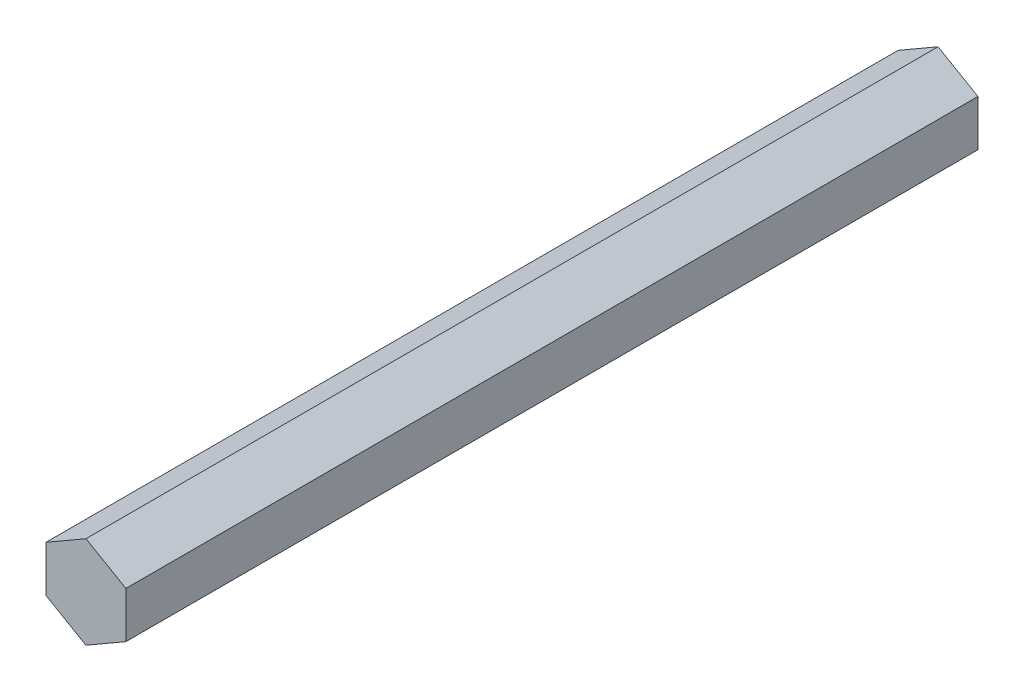
ISO-10303-21;
HEADER;
FILE_DESCRIPTION(('STEP AP214'),'2;1');
FILE_NAME('part.step','',(''),(''),'','','');
FILE_SCHEMA(('AUTOMOTIVE_DESIGN { 1 0 10303 214 1 1 1 1 }'));
ENDSEC;
DATA;
#1=APPLICATION_CONTEXT('core data for automotive mechanical design processes');
#2=APPLICATION_PROTOCOL_DEFINITION('international standard','automotive_design',2000,#1);
#3=PRODUCT_CONTEXT('',#1,'mechanical');
#4=PRODUCT('Part','Part','',(#3));
#5=PRODUCT_RELATED_PRODUCT_CATEGORY('part','',(#4));
#6=PRODUCT_DEFINITION_FORMATION('','',#4);
#7=PRODUCT_DEFINITION_CONTEXT('part definition',#1,'design');
#8=PRODUCT_DEFINITION('design','',#6,#7);
#9=PRODUCT_DEFINITION_SHAPE('','',#8);
#10=(LENGTH_UNIT() NAMED_UNIT(*) SI_UNIT(.MILLI.,.METRE.));
#11=(NAMED_UNIT(*) PLANE_ANGLE_UNIT() SI_UNIT($,.RADIAN.));
#12=(NAMED_UNIT(*) SI_UNIT($,.STERADIAN.) SOLID_ANGLE_UNIT());
#13=UNCERTAINTY_MEASURE_WITH_UNIT(LENGTH_MEASURE(1.E-05),#10,'distance_accuracy_value','');
#14=(GEOMETRIC_REPRESENTATION_CONTEXT(3) GLOBAL_UNCERTAINTY_ASSIGNED_CONTEXT((#13)) GLOBAL_UNIT_ASSIGNED_CONTEXT((#10,
#11,#12)) REPRESENTATION_CONTEXT('',''));
#15=CARTESIAN_POINT('',(0.,0.,0.));
#16=DIRECTION('',(0.,0.,1.));
#17=DIRECTION('',(1.,0.,0.));
#18=AXIS2_PLACEMENT_3D('',#15,#16,#17);
#19=CARTESIAN_POINT('',(4.7625,2.7496306570156,50.8));
#20=DIRECTION('',(-0.5,-0.866025403784439,0.));
#21=DIRECTION('',(0.866025403784439,-0.5,0.));
#22=AXIS2_PLACEMENT_3D('',#19,#20,#21);
#23=PLANE('',#22);
#24=DIRECTION('',(0.,0.,-1.));
#25=VECTOR('',#24,1.);
#26=CARTESIAN_POINT('',(4.7625,2.7496306570156,50.8));
#27=LINE('',#26,#25);
#28=CARTESIAN_POINT('',(4.7625,2.7496306570156,50.8));
#29=VERTEX_POINT('',#28);
#30=CARTESIAN_POINT('',(4.7625,2.7496306570156,-50.8));
#31=VERTEX_POINT('',#30);
#32=EDGE_CURVE('E111',#29,#31,#27,.T.);
#33=ORIENTED_EDGE('',*,*,#32,.T.);
#34=DIRECTION('',(-0.866025403784439,0.5,0.));
#35=VECTOR('',#34,1.);
#36=CARTESIAN_POINT('',(4.7625,2.7496306570156,-50.8));
#37=LINE('',#36,#35);
#38=CARTESIAN_POINT('',(0.,5.49926131403119,-50.8));
#39=VERTEX_POINT('',#38);
#40=EDGE_CURVE('E104',#31,#39,#37,.T.);
#41=ORIENTED_EDGE('',*,*,#40,.T.);
#42=DIRECTION('',(0.,0.,-1.));
#43=VECTOR('',#42,1.);
#44=CARTESIAN_POINT('',(0.,5.49926131403119,50.8));
#45=LINE('',#44,#43);
#46=CARTESIAN_POINT('',(0.,5.49926131403119,50.8));
#47=VERTEX_POINT('',#46);
#48=EDGE_CURVE('E11',#47,#39,#45,.T.);
#49=ORIENTED_EDGE('',*,*,#48,.F.);
#50=DIRECTION('',(-0.866025403784439,0.5,0.));
#51=VECTOR('',#50,1.);
#52=CARTESIAN_POINT('',(4.7625,2.7496306570156,50.8));
#53=LINE('',#52,#51);
#54=EDGE_CURVE('E128',#29,#47,#53,.T.);
#55=ORIENTED_EDGE('',*,*,#54,.F.);
#56=EDGE_LOOP('',(#33,#41,#49,#55));
#57=FACE_BOUND('',#56,.T.);
#58=ADVANCED_FACE('F39',(#57),#23,.F.);
#59=CARTESIAN_POINT('',(0.,5.49926131403119,50.8));
#60=DIRECTION('',(0.5,-0.866025403784438,0.));
#61=DIRECTION('',(0.866025403784438,0.5,0.));
#62=AXIS2_PLACEMENT_3D('',#59,#60,#61);
#63=PLANE('',#62);
#64=ORIENTED_EDGE('',*,*,#48,.T.);
#65=DIRECTION('',(-0.866025403784438,-0.5,0.));
#66=VECTOR('',#65,1.);
#67=CARTESIAN_POINT('',(0.,5.49926131403119,-50.8));
#68=LINE('',#67,#66);
#69=CARTESIAN_POINT('',(-4.7625,2.74963065701559,-50.8));
#70=VERTEX_POINT('',#69);
#71=EDGE_CURVE('E94',#39,#70,#68,.T.);
#72=ORIENTED_EDGE('',*,*,#71,.T.);
#73=DIRECTION('',(0.,0.,-1.));
#74=VECTOR('',#73,1.);
#75=CARTESIAN_POINT('',(-4.7625,2.74963065701559,50.8));
#76=LINE('',#75,#74);
#77=CARTESIAN_POINT('',(-4.7625,2.74963065701559,50.8));
#78=VERTEX_POINT('',#77);
#79=EDGE_CURVE('E47',#78,#70,#76,.T.);
#80=ORIENTED_EDGE('',*,*,#79,.F.);
#81=DIRECTION('',(-0.866025403784438,-0.5,0.));
#82=VECTOR('',#81,1.);
#83=CARTESIAN_POINT('',(0.,5.49926131403119,50.8));
#84=LINE('',#83,#82);
#85=EDGE_CURVE('E95',#47,#78,#84,.T.);
#86=ORIENTED_EDGE('',*,*,#85,.F.);
#87=EDGE_LOOP('',(#64,#72,#80,#86));
#88=FACE_BOUND('',#87,.T.);
#89=ADVANCED_FACE('F92',(#88),#63,.F.);
#90=CARTESIAN_POINT('',(-4.7625,2.74963065701559,50.8));
#91=DIRECTION('',(1.,0.,0.));
#92=DIRECTION('',(0.,1.,0.));
#93=AXIS2_PLACEMENT_3D('',#90,#91,#92);
#94=PLANE('',#93);
#95=ORIENTED_EDGE('',*,*,#79,.T.);
#96=DIRECTION('',(0.,-1.,0.));
#97=VECTOR('',#96,1.);
#98=CARTESIAN_POINT('',(-4.7625,2.74963065701559,-50.8));
#99=LINE('',#98,#97);
#100=CARTESIAN_POINT('',(-4.7625,-2.7496306570156,-50.8));
#101=VERTEX_POINT('',#100);
#102=EDGE_CURVE('E108',#70,#101,#99,.T.);
#103=ORIENTED_EDGE('',*,*,#102,.T.);
#104=DIRECTION('',(0.,0.,-1.));
#105=VECTOR('',#104,1.);
#106=CARTESIAN_POINT('',(-4.7625,-2.7496306570156,50.8));
#107=LINE('',#106,#105);
#108=CARTESIAN_POINT('',(-4.7625,-2.7496306570156,50.8));
#109=VERTEX_POINT('',#108);
#110=EDGE_CURVE('E151',#109,#101,#107,.T.);
#111=ORIENTED_EDGE('',*,*,#110,.F.);
#112=DIRECTION('',(0.,-1.,0.));
#113=VECTOR('',#112,1.);
#114=CARTESIAN_POINT('',(-4.7625,2.74963065701559,50.8));
#115=LINE('',#114,#113);
#116=EDGE_CURVE('E133',#78,#109,#115,.T.);
#117=ORIENTED_EDGE('',*,*,#116,.F.);
#118=EDGE_LOOP('',(#95,#103,#111,#117));
#119=FACE_BOUND('',#118,.T.);
#120=ADVANCED_FACE('F156',(#119),#94,.F.);
#121=CARTESIAN_POINT('',(-4.7625,-2.7496306570156,50.8));
#122=DIRECTION('',(0.5,0.866025403784439,0.));
#123=DIRECTION('',(-0.866025403784439,0.5,0.));
#124=AXIS2_PLACEMENT_3D('',#121,#122,#123);
#125=PLANE('',#124);
#126=ORIENTED_EDGE('',*,*,#110,.T.);
#127=DIRECTION('',(0.866025403784439,-0.5,0.));
#128=VECTOR('',#127,1.);
#129=CARTESIAN_POINT('',(-4.7625,-2.7496306570156,-50.8));
#130=LINE('',#129,#128);
#131=CARTESIAN_POINT('',(0.,-5.49926131403119,-50.8));
#132=VERTEX_POINT('',#131);
#133=EDGE_CURVE('E117',#101,#132,#130,.T.);
#134=ORIENTED_EDGE('',*,*,#133,.T.);
#135=DIRECTION('',(0.,0.,-1.));
#136=VECTOR('',#135,1.);
#137=CARTESIAN_POINT('',(0.,-5.49926131403119,50.8));
#138=LINE('',#137,#136);
#139=CARTESIAN_POINT('',(0.,-5.49926131403119,50.8));
#140=VERTEX_POINT('',#139);
#141=EDGE_CURVE('E148',#140,#132,#138,.T.);
#142=ORIENTED_EDGE('',*,*,#141,.F.);
#143=DIRECTION('',(0.866025403784439,-0.5,0.));
#144=VECTOR('',#143,1.);
#145=CARTESIAN_POINT('',(-4.7625,-2.7496306570156,50.8));
#146=LINE('',#145,#144);
#147=EDGE_CURVE('E136',#109,#140,#146,.T.);
#148=ORIENTED_EDGE('',*,*,#147,.F.);
#149=EDGE_LOOP('',(#126,#134,#142,#148));
#150=FACE_BOUND('',#149,.T.);
#151=ADVANCED_FACE('F162',(#150),#125,.F.);
#152=CARTESIAN_POINT('',(0.,-5.49926131403119,50.8));
#153=DIRECTION('',(-0.5,0.866025403784439,0.));
#154=DIRECTION('',(-0.866025403784439,-0.5,0.));
#155=AXIS2_PLACEMENT_3D('',#152,#153,#154);
#156=PLANE('',#155);
#157=ORIENTED_EDGE('',*,*,#141,.T.);
#158=DIRECTION('',(0.866025403784439,0.5,0.));
#159=VECTOR('',#158,1.);
#160=CARTESIAN_POINT('',(0.,-5.49926131403119,-50.8));
#161=LINE('',#160,#159);
#162=CARTESIAN_POINT('',(4.7625,-2.74963065701559,-50.8));
#163=VERTEX_POINT('',#162);
#164=EDGE_CURVE('E121',#132,#163,#161,.T.);
#165=ORIENTED_EDGE('',*,*,#164,.T.);
#166=DIRECTION('',(0.,0.,-1.));
#167=VECTOR('',#166,1.);
#168=CARTESIAN_POINT('',(4.7625,-2.74963065701559,50.8));
#169=LINE('',#168,#167);
#170=CARTESIAN_POINT('',(4.7625,-2.74963065701559,50.8));
#171=VERTEX_POINT('',#170);
#172=EDGE_CURVE('E145',#171,#163,#169,.T.);
#173=ORIENTED_EDGE('',*,*,#172,.F.);
#174=DIRECTION('',(0.866025403784439,0.5,0.));
#175=VECTOR('',#174,1.);
#176=CARTESIAN_POINT('',(0.,-5.49926131403119,50.8));
#177=LINE('',#176,#175);
#178=EDGE_CURVE('E59',#140,#171,#177,.T.);
#179=ORIENTED_EDGE('',*,*,#178,.F.);
#180=EDGE_LOOP('',(#157,#165,#173,#179));
#181=FACE_BOUND('',#180,.T.);
#182=ADVANCED_FACE('F165',(#181),#156,.F.);
#183=CARTESIAN_POINT('',(4.7625,-2.74963065701559,50.8));
#184=DIRECTION('',(-1.,0.,0.));
#185=DIRECTION('',(0.,0.,1.));
#186=AXIS2_PLACEMENT_3D('',#183,#184,#185);
#187=PLANE('',#186);
#188=ORIENTED_EDGE('',*,*,#172,.T.);
#189=DIRECTION('',(0.,1.,0.));
#190=VECTOR('',#189,1.);
#191=CARTESIAN_POINT('',(4.7625,-2.74963065701559,-50.8));
#192=LINE('',#191,#190);
#193=EDGE_CURVE('E125',#163,#31,#192,.T.);
#194=ORIENTED_EDGE('',*,*,#193,.T.);
#195=ORIENTED_EDGE('',*,*,#32,.F.);
#196=DIRECTION('',(0.,1.,0.));
#197=VECTOR('',#196,1.);
#198=CARTESIAN_POINT('',(4.7625,-2.74963065701559,50.8));
#199=LINE('',#198,#197);
#200=EDGE_CURVE('E54',#171,#29,#199,.T.);
#201=ORIENTED_EDGE('',*,*,#200,.F.);
#202=EDGE_LOOP('',(#188,#194,#195,#201));
#203=FACE_BOUND('',#202,.T.);
#204=ADVANCED_FACE('F167',(#203),#187,.F.);
#205=CARTESIAN_POINT('',(0.,0.,50.8));
#206=DIRECTION('',(0.,0.,1.));
#207=DIRECTION('',(1.,0.,0.));
#208=AXIS2_PLACEMENT_3D('',#205,#206,#207);
#209=PLANE('',#208);
#210=ORIENTED_EDGE('',*,*,#54,.T.);
#211=ORIENTED_EDGE('',*,*,#85,.T.);
#212=ORIENTED_EDGE('',*,*,#116,.T.);
#213=ORIENTED_EDGE('',*,*,#147,.T.);
#214=ORIENTED_EDGE('',*,*,#178,.T.);
#215=ORIENTED_EDGE('',*,*,#200,.T.);
#216=EDGE_LOOP('',(#210,#211,#212,#213,#214,#215));
#217=FACE_BOUND('',#216,.T.);
#218=ADVANCED_FACE('F159',(#217),#209,.T.);
#219=CARTESIAN_POINT('',(0.,0.,-50.8));
#220=DIRECTION('',(0.,0.,1.));
#221=DIRECTION('',(1.,0.,0.));
#222=AXIS2_PLACEMENT_3D('',#219,#220,#221);
#223=PLANE('',#222);
#224=ORIENTED_EDGE('',*,*,#40,.F.);
#225=ORIENTED_EDGE('',*,*,#193,.F.);
#226=ORIENTED_EDGE('',*,*,#164,.F.);
#227=ORIENTED_EDGE('',*,*,#133,.F.);
#228=ORIENTED_EDGE('',*,*,#102,.F.);
#229=ORIENTED_EDGE('',*,*,#71,.F.);
#230=EDGE_LOOP('',(#224,#225,#226,#227,#228,#229));
#231=FACE_BOUND('',#230,.T.);
#232=ADVANCED_FACE('F102',(#231),#223,.F.);
#233=CLOSED_SHELL('',(#58,#89,#120,#151,#182,#204,#218,#232));
#234=MANIFOLD_SOLID_BREP('B2',#233);
#235=ADVANCED_BREP_SHAPE_REPRESENTATION('',(#18,#234),#14);
#236=SHAPE_DEFINITION_REPRESENTATION(#9,#235);
ENDSEC;
END-ISO-10303-21;
